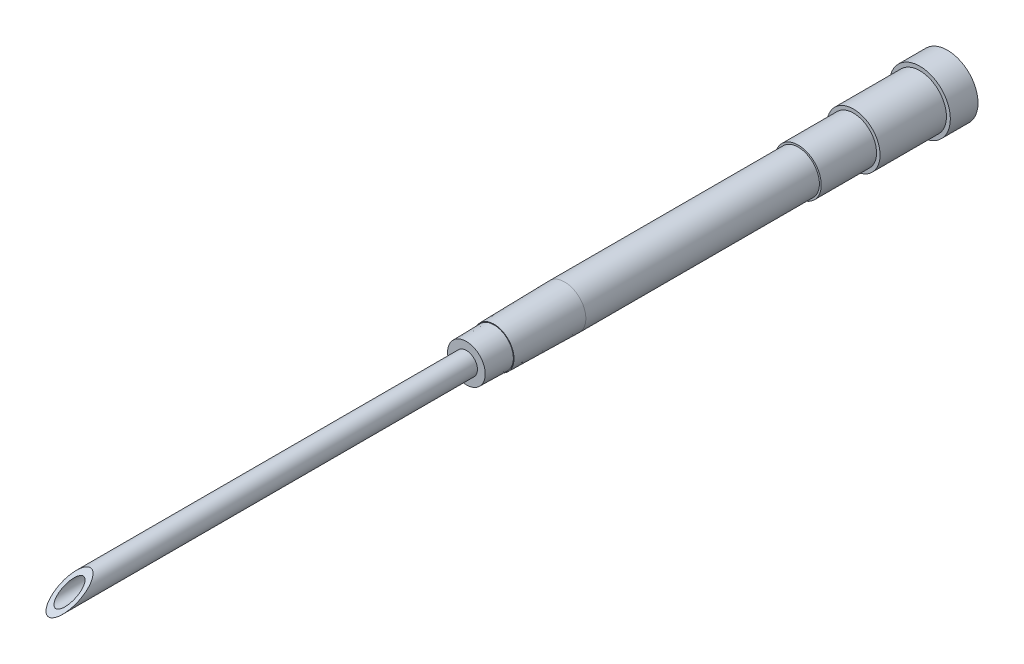
ISO-10303-21;
HEADER;
FILE_DESCRIPTION(('STEP AP214'),'2;1');
FILE_NAME('part.step','',(''),(''),'','','');
FILE_SCHEMA(('AUTOMOTIVE_DESIGN { 1 0 10303 214 1 1 1 1 }'));
ENDSEC;
DATA;
#1=APPLICATION_CONTEXT('core data for automotive mechanical design processes');
#2=APPLICATION_PROTOCOL_DEFINITION('international standard','automotive_design',2000,#1);
#3=PRODUCT_CONTEXT('',#1,'mechanical');
#4=PRODUCT('Part','Part','',(#3));
#5=PRODUCT_RELATED_PRODUCT_CATEGORY('part','',(#4));
#6=PRODUCT_DEFINITION_FORMATION('','',#4);
#7=PRODUCT_DEFINITION_CONTEXT('part definition',#1,'design');
#8=PRODUCT_DEFINITION('design','',#6,#7);
#9=PRODUCT_DEFINITION_SHAPE('','',#8);
#10=(LENGTH_UNIT() NAMED_UNIT(*) SI_UNIT(.MILLI.,.METRE.));
#11=(NAMED_UNIT(*) PLANE_ANGLE_UNIT() SI_UNIT($,.RADIAN.));
#12=(NAMED_UNIT(*) SI_UNIT($,.STERADIAN.) SOLID_ANGLE_UNIT());
#13=UNCERTAINTY_MEASURE_WITH_UNIT(LENGTH_MEASURE(1.E-05),#10,'distance_accuracy_value','');
#14=(GEOMETRIC_REPRESENTATION_CONTEXT(3) GLOBAL_UNCERTAINTY_ASSIGNED_CONTEXT((#13)) GLOBAL_UNIT_ASSIGNED_CONTEXT((#10,
#11,#12)) REPRESENTATION_CONTEXT('',''));
#15=CARTESIAN_POINT('',(0.,0.,0.));
#16=DIRECTION('',(0.,0.,1.));
#17=DIRECTION('',(1.,0.,0.));
#18=AXIS2_PLACEMENT_3D('',#15,#16,#17);
#19=CARTESIAN_POINT('',(0.,0.,5.));
#20=DIRECTION('',(0.,0.,-1.));
#21=DIRECTION('',(-1.,0.,0.));
#22=AXIS2_PLACEMENT_3D('',#19,#20,#21);
#23=CYLINDRICAL_SURFACE('',#22,5.51073402653034);
#24=CARTESIAN_POINT('',(0.,0.,5.));
#25=DIRECTION('',(0.,0.,1.));
#26=DIRECTION('',(1.,0.,0.));
#27=AXIS2_PLACEMENT_3D('',#24,#25,#26);
#28=CIRCLE('',#27,5.51073402653034);
#29=CARTESIAN_POINT('',(5.51073402653034,0.,5.));
#30=VERTEX_POINT('',#29);
#31=EDGE_CURVE('E71',#30,#30,#28,.T.);
#32=ORIENTED_EDGE('',*,*,#31,.F.);
#33=EDGE_LOOP('',(#32));
#34=FACE_BOUND('',#33,.T.);
#35=CARTESIAN_POINT('',(0.,0.,0.));
#36=DIRECTION('',(0.,0.,1.));
#37=DIRECTION('',(1.,0.,0.));
#38=AXIS2_PLACEMENT_3D('',#35,#36,#37);
#39=CIRCLE('',#38,5.51073402653034);
#40=CARTESIAN_POINT('',(5.51073402653034,0.,0.));
#41=VERTEX_POINT('',#40);
#42=EDGE_CURVE('E68',#41,#41,#39,.T.);
#43=ORIENTED_EDGE('',*,*,#42,.T.);
#44=EDGE_LOOP('',(#43));
#45=FACE_BOUND('',#44,.T.);
#46=ADVANCED_FACE('F31',(#34,#45),#23,.T.);
#47=CARTESIAN_POINT('',(0.,0.,5.));
#48=DIRECTION('',(0.,0.,1.));
#49=DIRECTION('',(1.,0.,0.));
#50=AXIS2_PLACEMENT_3D('',#47,#48,#49);
#51=PLANE('',#50);
#52=CARTESIAN_POINT('',(0.,0.,5.));
#53=DIRECTION('',(0.,0.,1.));
#54=DIRECTION('',(1.,0.,0.));
#55=AXIS2_PLACEMENT_3D('',#52,#53,#54);
#56=CIRCLE('',#55,4.80322662962322);
#57=CARTESIAN_POINT('',(4.80322662962322,0.,5.));
#58=VERTEX_POINT('',#57);
#59=EDGE_CURVE('E65',#58,#58,#56,.T.);
#60=ORIENTED_EDGE('',*,*,#59,.F.);
#61=EDGE_LOOP('',(#60));
#62=FACE_BOUND('',#61,.T.);
#63=ORIENTED_EDGE('',*,*,#31,.T.);
#64=EDGE_LOOP('',(#63));
#65=FACE_BOUND('',#64,.T.);
#66=ADVANCED_FACE('F97',(#62,#65),#51,.T.);
#67=CARTESIAN_POINT('',(0.,0.,0.));
#68=DIRECTION('',(0.,0.,1.));
#69=DIRECTION('',(1.,0.,0.));
#70=AXIS2_PLACEMENT_3D('',#67,#68,#69);
#71=PLANE('',#70);
#72=CARTESIAN_POINT('',(0.,0.,0.));
#73=DIRECTION('',(0.,0.,1.));
#74=DIRECTION('',(1.,0.,0.));
#75=AXIS2_PLACEMENT_3D('',#72,#73,#74);
#76=CIRCLE('',#75,1.32099083144696);
#77=CARTESIAN_POINT('',(1.32099083144696,0.,0.));
#78=VERTEX_POINT('',#77);
#79=EDGE_CURVE('E47',#78,#78,#76,.T.);
#80=ORIENTED_EDGE('',*,*,#79,.T.);
#81=EDGE_LOOP('',(#80));
#82=FACE_BOUND('',#81,.T.);
#83=ORIENTED_EDGE('',*,*,#42,.F.);
#84=EDGE_LOOP('',(#83));
#85=FACE_BOUND('',#84,.T.);
#86=ADVANCED_FACE('F103',(#82,#85),#71,.F.);
#87=CARTESIAN_POINT('',(0.,0.,17.));
#88=DIRECTION('',(0.,0.,-1.));
#89=DIRECTION('',(-1.,0.,0.));
#90=AXIS2_PLACEMENT_3D('',#87,#88,#89);
#91=CYLINDRICAL_SURFACE('',#90,4.80322662962322);
#92=CARTESIAN_POINT('',(0.,0.,17.));
#93=DIRECTION('',(0.,0.,1.));
#94=DIRECTION('',(1.,0.,0.));
#95=AXIS2_PLACEMENT_3D('',#92,#93,#94);
#96=CIRCLE('',#95,4.80322662962322);
#97=CARTESIAN_POINT('',(4.80322662962322,0.,17.));
#98=VERTEX_POINT('',#97);
#99=EDGE_CURVE('E62',#98,#98,#96,.T.);
#100=ORIENTED_EDGE('',*,*,#99,.F.);
#101=EDGE_LOOP('',(#100));
#102=FACE_BOUND('',#101,.T.);
#103=ORIENTED_EDGE('',*,*,#59,.T.);
#104=EDGE_LOOP('',(#103));
#105=FACE_BOUND('',#104,.T.);
#106=ADVANCED_FACE('F110',(#102,#105),#91,.T.);
#107=CARTESIAN_POINT('',(0.,0.,17.));
#108=DIRECTION('',(0.,0.,1.));
#109=DIRECTION('',(1.,0.,0.));
#110=AXIS2_PLACEMENT_3D('',#107,#108,#109);
#111=PLANE('',#110);
#112=CARTESIAN_POINT('',(0.,0.,17.));
#113=DIRECTION('',(0.,0.,1.));
#114=DIRECTION('',(1.,0.,0.));
#115=AXIS2_PLACEMENT_3D('',#112,#113,#114);
#116=CIRCLE('',#115,4.16539104583814);
#117=CARTESIAN_POINT('',(4.16539104583814,0.,17.));
#118=VERTEX_POINT('',#117);
#119=EDGE_CURVE('E59',#118,#118,#116,.T.);
#120=ORIENTED_EDGE('',*,*,#119,.F.);
#121=EDGE_LOOP('',(#120));
#122=FACE_BOUND('',#121,.T.);
#123=ORIENTED_EDGE('',*,*,#99,.T.);
#124=EDGE_LOOP('',(#123));
#125=FACE_BOUND('',#124,.T.);
#126=ADVANCED_FACE('F115',(#122,#125),#111,.T.);
#127=CARTESIAN_POINT('',(0.,0.,27.));
#128=DIRECTION('',(0.,0.,-1.));
#129=DIRECTION('',(-1.,0.,0.));
#130=AXIS2_PLACEMENT_3D('',#127,#128,#129);
#131=CYLINDRICAL_SURFACE('',#130,4.16539104583814);
#132=CARTESIAN_POINT('',(0.,0.,27.));
#133=DIRECTION('',(0.,0.,1.));
#134=DIRECTION('',(1.,0.,0.));
#135=AXIS2_PLACEMENT_3D('',#132,#133,#134);
#136=CIRCLE('',#135,4.16539104583814);
#137=CARTESIAN_POINT('',(4.16539104583814,0.,27.));
#138=VERTEX_POINT('',#137);
#139=EDGE_CURVE('E55',#138,#138,#136,.T.);
#140=ORIENTED_EDGE('',*,*,#139,.F.);
#141=EDGE_LOOP('',(#140));
#142=FACE_BOUND('',#141,.T.);
#143=ORIENTED_EDGE('',*,*,#119,.T.);
#144=EDGE_LOOP('',(#143));
#145=FACE_BOUND('',#144,.T.);
#146=ADVANCED_FACE('F92',(#142,#145),#131,.T.);
#147=CARTESIAN_POINT('',(0.,0.,27.));
#148=DIRECTION('',(0.,0.,1.));
#149=DIRECTION('',(1.,0.,0.));
#150=AXIS2_PLACEMENT_3D('',#147,#148,#149);
#151=PLANE('',#150);
#152=CARTESIAN_POINT('',(0.,0.,27.));
#153=DIRECTION('',(0.,0.,1.));
#154=DIRECTION('',(1.,0.,0.));
#155=AXIS2_PLACEMENT_3D('',#152,#153,#154);
#156=CIRCLE('',#155,3.83329587580678);
#157=CARTESIAN_POINT('',(3.83329587580678,0.,27.));
#158=VERTEX_POINT('',#157);
#159=EDGE_CURVE('E56',#158,#158,#156,.T.);
#160=ORIENTED_EDGE('',*,*,#159,.F.);
#161=EDGE_LOOP('',(#160));
#162=FACE_BOUND('',#161,.T.);
#163=ORIENTED_EDGE('',*,*,#139,.T.);
#164=EDGE_LOOP('',(#163));
#165=FACE_BOUND('',#164,.T.);
#166=ADVANCED_FACE('F83',(#162,#165),#151,.T.);
#167=CARTESIAN_POINT('',(0.,0.,42.));
#168=DIRECTION('',(0.,0.,-1.));
#169=DIRECTION('',(-1.,0.,0.));
#170=AXIS2_PLACEMENT_3D('',#167,#168,#169);
#171=CYLINDRICAL_SURFACE('',#170,3.83329587580678);
#172=ORIENTED_EDGE('',*,*,#159,.T.);
#173=EDGE_LOOP('',(#172));
#174=FACE_BOUND('',#173,.T.);
#175=CARTESIAN_POINT('',(0.,0.,69.2327965857043));
#176=DIRECTION('',(0.,0.,-1.));
#177=DIRECTION('',(-1.,0.,0.));
#178=AXIS2_PLACEMENT_3D('',#175,#176,#177);
#179=CIRCLE('',#178,3.83329587580678);
#180=CARTESIAN_POINT('',(-3.83329587580678,0.,69.2327965857043));
#181=VERTEX_POINT('',#180);
#182=EDGE_CURVE('E44',#181,#181,#179,.F.);
#183=ORIENTED_EDGE('',*,*,#182,.F.);
#184=EDGE_LOOP('',(#183));
#185=FACE_BOUND('',#184,.T.);
#186=ADVANCED_FACE('F81',(#174,#185),#171,.T.);
#187=CARTESIAN_POINT('',(0.,0.,82.));
#188=DIRECTION('',(0.,0.,-1.));
#189=DIRECTION('',(1.,0.,0.));
#190=AXIS2_PLACEMENT_3D('',#187,#188,#189);
#191=CONICAL_SURFACE('',#190,3.61044351125849,0.0174532925199433);
#192=CARTESIAN_POINT('',(0.,0.,82.));
#193=DIRECTION('',(0.,0.,1.));
#194=DIRECTION('',(1.,0.,0.));
#195=AXIS2_PLACEMENT_3D('',#192,#193,#194);
#196=CIRCLE('',#195,3.61044351125849);
#197=CARTESIAN_POINT('',(3.61044351125849,0.,82.));
#198=VERTEX_POINT('',#197);
#199=EDGE_CURVE('E52',#198,#198,#196,.T.);
#200=ORIENTED_EDGE('',*,*,#199,.F.);
#201=EDGE_LOOP('',(#200));
#202=FACE_BOUND('',#201,.T.);
#203=ORIENTED_EDGE('',*,*,#182,.T.);
#204=EDGE_LOOP('',(#203));
#205=FACE_BOUND('',#204,.T.);
#206=ADVANCED_FACE('F79',(#202,#205),#191,.T.);
#207=CARTESIAN_POINT('',(0.,0.,82.));
#208=DIRECTION('',(0.,0.,1.));
#209=DIRECTION('',(1.,0.,0.));
#210=AXIS2_PLACEMENT_3D('',#207,#208,#209);
#211=PLANE('',#210);
#212=CARTESIAN_POINT('',(0.,0.,82.));
#213=DIRECTION('',(0.,0.,1.));
#214=DIRECTION('',(1.,0.,0.));
#215=AXIS2_PLACEMENT_3D('',#212,#213,#214);
#216=CIRCLE('',#215,3.49213692214024);
#217=CARTESIAN_POINT('',(3.49213692214024,0.,82.));
#218=VERTEX_POINT('',#217);
#219=EDGE_CURVE('E39',#218,#218,#216,.T.);
#220=ORIENTED_EDGE('',*,*,#219,.F.);
#221=EDGE_LOOP('',(#220));
#222=FACE_BOUND('',#221,.T.);
#223=ORIENTED_EDGE('',*,*,#199,.T.);
#224=EDGE_LOOP('',(#223));
#225=FACE_BOUND('',#224,.T.);
#226=ADVANCED_FACE('F90',(#222,#225),#211,.T.);
#227=CARTESIAN_POINT('',(0.,0.,87.));
#228=DIRECTION('',(0.,0.,-1.));
#229=DIRECTION('',(1.,0.,0.));
#230=AXIS2_PLACEMENT_3D('',#227,#228,#229);
#231=CONICAL_SURFACE('',#230,3.40486159749915,0.0174532925199433);
#232=CARTESIAN_POINT('',(0.,0.,87.));
#233=DIRECTION('',(0.,0.,1.));
#234=DIRECTION('',(1.,0.,0.));
#235=AXIS2_PLACEMENT_3D('',#232,#233,#234);
#236=CIRCLE('',#235,3.40486159749915);
#237=CARTESIAN_POINT('',(3.40486159749915,0.,87.));
#238=VERTEX_POINT('',#237);
#239=EDGE_CURVE('E49',#238,#238,#236,.T.);
#240=ORIENTED_EDGE('',*,*,#239,.F.);
#241=EDGE_LOOP('',(#240));
#242=FACE_BOUND('',#241,.T.);
#243=ORIENTED_EDGE('',*,*,#219,.T.);
#244=EDGE_LOOP('',(#243));
#245=FACE_BOUND('',#244,.T.);
#246=ADVANCED_FACE('F33',(#242,#245),#231,.T.);
#247=CARTESIAN_POINT('',(0.,0.,87.));
#248=DIRECTION('',(0.,0.,1.));
#249=DIRECTION('',(1.,0.,0.));
#250=AXIS2_PLACEMENT_3D('',#247,#248,#249);
#251=PLANE('',#250);
#252=CARTESIAN_POINT('',(0.,0.,87.));
#253=DIRECTION('',(0.,0.,1.));
#254=DIRECTION('',(1.,0.,0.));
#255=AXIS2_PLACEMENT_3D('',#252,#253,#254);
#256=CIRCLE('',#255,1.99967731392361);
#257=CARTESIAN_POINT('',(1.99967731392361,0.,87.));
#258=VERTEX_POINT('',#257);
#259=EDGE_CURVE('E10',#258,#258,#256,.T.);
#260=ORIENTED_EDGE('',*,*,#259,.F.);
#261=EDGE_LOOP('',(#260));
#262=FACE_BOUND('',#261,.T.);
#263=ORIENTED_EDGE('',*,*,#239,.T.);
#264=EDGE_LOOP('',(#263));
#265=FACE_BOUND('',#264,.T.);
#266=ADVANCED_FACE('F166',(#262,#265),#251,.T.);
#267=CARTESIAN_POINT('',(0.,0.,167.));
#268=DIRECTION('',(0.,0.,-1.));
#269=DIRECTION('',(-1.,0.,0.));
#270=AXIS2_PLACEMENT_3D('',#267,#268,#269);
#271=CYLINDRICAL_SURFACE('',#270,1.99967731392361);
#272=CARTESIAN_POINT('',(0.,0.,158.765928535486));
#273=DIRECTION('',(0.,-0.882498684185669,-0.470314865181362));
#274=DIRECTION('',(0.,0.470314865181362,-0.882498684185669));
#275=AXIS2_PLACEMENT_3D('',#272,#273,#274);
#276=ELLIPSE('',#275,4.25178420238216,1.99967731392361);
#277=CARTESIAN_POINT('',(0.,1.99967731392361,155.013734571442));
#278=VERTEX_POINT('',#277);
#279=EDGE_CURVE('E222',#278,#278,#276,.T.);
#280=ORIENTED_EDGE('',*,*,#279,.T.);
#281=EDGE_LOOP('',(#280));
#282=FACE_BOUND('',#281,.T.);
#283=ORIENTED_EDGE('',*,*,#259,.T.);
#284=EDGE_LOOP('',(#283));
#285=FACE_BOUND('',#284,.T.);
#286=ADVANCED_FACE('F175',(#282,#285),#271,.T.);
#287=CARTESIAN_POINT('',(0.,0.,-3.));
#288=DIRECTION('',(0.,0.,1.));
#289=DIRECTION('',(1.,0.,0.));
#290=AXIS2_PLACEMENT_3D('',#287,#288,#289);
#291=CYLINDRICAL_SURFACE('',#290,1.32099083144696);
#292=CARTESIAN_POINT('',(0.,0.,158.765928535486));
#293=DIRECTION('',(0.,-0.882498684185669,-0.470314865181362));
#294=DIRECTION('',(0.,-0.470314865181362,0.882498684185669));
#295=AXIS2_PLACEMENT_3D('',#292,#293,#294);
#296=ELLIPSE('',#295,2.80873714450333,1.32099083144696);
#297=CARTESIAN_POINT('',(0.,-1.32099083144696,161.244635369734));
#298=VERTEX_POINT('',#297);
#299=EDGE_CURVE('E35',#298,#298,#296,.F.);
#300=ORIENTED_EDGE('',*,*,#299,.T.);
#301=EDGE_LOOP('',(#300));
#302=FACE_BOUND('',#301,.T.);
#303=ORIENTED_EDGE('',*,*,#79,.F.);
#304=EDGE_LOOP('',(#303));
#305=FACE_BOUND('',#304,.T.);
#306=ADVANCED_FACE('F193',(#302,#305),#291,.F.);
#307=CARTESIAN_POINT('',(-37.2583553353047,-7.71684420933383,173.245812895885));
#308=DIRECTION('',(0.,-0.882498684185669,-0.470314865181362));
#309=DIRECTION('',(0.,0.470314865181362,-0.882498684185669));
#310=AXIS2_PLACEMENT_3D('',#307,#308,#309);
#311=PLANE('',#310);
#312=ORIENTED_EDGE('',*,*,#299,.F.);
#313=EDGE_LOOP('',(#312));
#314=FACE_BOUND('',#313,.T.);
#315=ORIENTED_EDGE('',*,*,#279,.F.);
#316=EDGE_LOOP('',(#315));
#317=FACE_BOUND('',#316,.T.);
#318=ADVANCED_FACE('F203',(#314,#317),#311,.F.);
#319=CLOSED_SHELL('',(#46,#66,#86,#106,#126,#146,#166,#186,#206,#226,#246,#266,#286,#306,#318));
#320=MANIFOLD_SOLID_BREP('B2',#319);
#321=ADVANCED_BREP_SHAPE_REPRESENTATION('',(#18,#320),#14);
#322=SHAPE_DEFINITION_REPRESENTATION(#9,#321);
ENDSEC;
END-ISO-10303-21;
